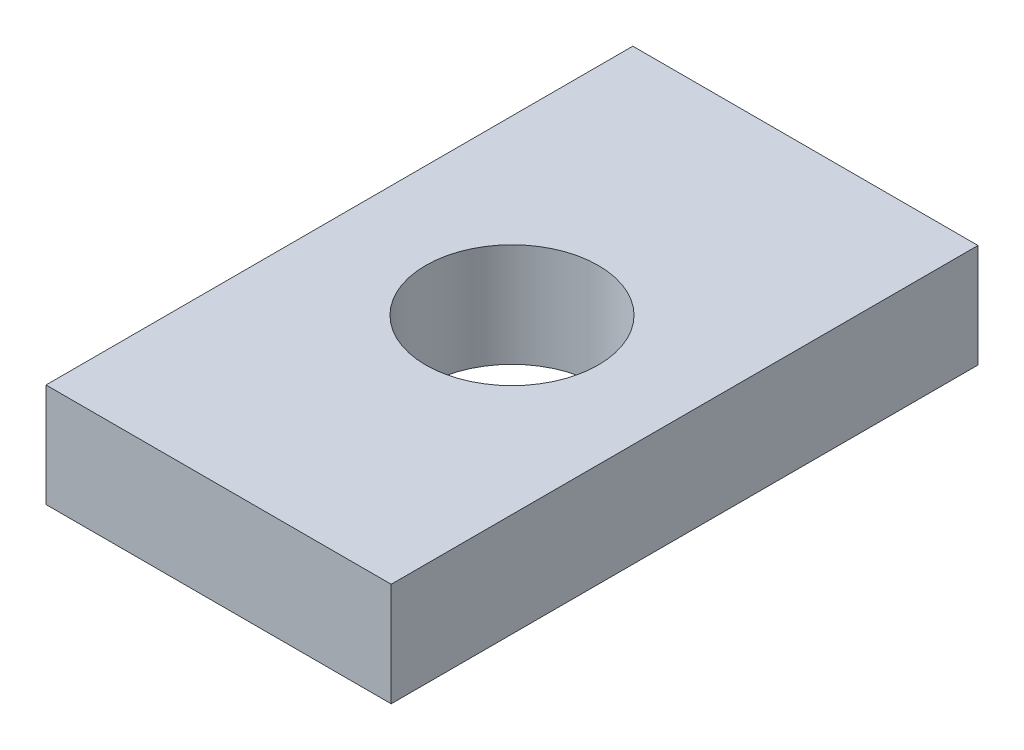
ISO-10303-21;
HEADER;
FILE_DESCRIPTION(('STEP AP214'),'2;1');
FILE_NAME('part.step','',(''),(''),'','','');
FILE_SCHEMA(('AUTOMOTIVE_DESIGN { 1 0 10303 214 1 1 1 1 }'));
ENDSEC;
DATA;
#1=APPLICATION_CONTEXT('core data for automotive mechanical design processes');
#2=APPLICATION_PROTOCOL_DEFINITION('international standard','automotive_design',2000,#1);
#3=PRODUCT_CONTEXT('',#1,'mechanical');
#4=PRODUCT('Part','Part','',(#3));
#5=PRODUCT_RELATED_PRODUCT_CATEGORY('part','',(#4));
#6=PRODUCT_DEFINITION_FORMATION('','',#4);
#7=PRODUCT_DEFINITION_CONTEXT('part definition',#1,'design');
#8=PRODUCT_DEFINITION('design','',#6,#7);
#9=PRODUCT_DEFINITION_SHAPE('','',#8);
#10=(LENGTH_UNIT() NAMED_UNIT(*) SI_UNIT(.MILLI.,.METRE.));
#11=(NAMED_UNIT(*) PLANE_ANGLE_UNIT() SI_UNIT($,.RADIAN.));
#12=(NAMED_UNIT(*) SI_UNIT($,.STERADIAN.) SOLID_ANGLE_UNIT());
#13=UNCERTAINTY_MEASURE_WITH_UNIT(LENGTH_MEASURE(1.E-05),#10,'distance_accuracy_value','');
#14=(GEOMETRIC_REPRESENTATION_CONTEXT(3) GLOBAL_UNCERTAINTY_ASSIGNED_CONTEXT((#13)) GLOBAL_UNIT_ASSIGNED_CONTEXT((#10,
#11,#12)) REPRESENTATION_CONTEXT('',''));
#15=CARTESIAN_POINT('',(0.,0.,0.));
#16=DIRECTION('',(0.,0.,1.));
#17=DIRECTION('',(1.,0.,0.));
#18=AXIS2_PLACEMENT_3D('',#15,#16,#17);
#19=CARTESIAN_POINT('',(0.,6.,0.));
#20=DIRECTION('',(0.,1.,0.));
#21=DIRECTION('',(0.,0.,1.));
#22=AXIS2_PLACEMENT_3D('',#19,#20,#21);
#23=PLANE('',#22);
#24=DIRECTION('',(0.,0.,-1.));
#25=VECTOR('',#24,1.);
#26=CARTESIAN_POINT('',(10.,6.,-17.));
#27=LINE('',#26,#25);
#28=CARTESIAN_POINT('',(10.,6.,17.));
#29=VERTEX_POINT('',#28);
#30=CARTESIAN_POINT('',(10.,6.,-17.));
#31=VERTEX_POINT('',#30);
#32=EDGE_CURVE('E85',#29,#31,#27,.T.);
#33=ORIENTED_EDGE('',*,*,#32,.T.);
#34=DIRECTION('',(-1.,0.,0.));
#35=VECTOR('',#34,1.);
#36=CARTESIAN_POINT('',(-10.,6.,-17.));
#37=LINE('',#36,#35);
#38=CARTESIAN_POINT('',(-10.,6.,-17.));
#39=VERTEX_POINT('',#38);
#40=EDGE_CURVE('E80',#31,#39,#37,.T.);
#41=ORIENTED_EDGE('',*,*,#40,.T.);
#42=DIRECTION('',(0.,0.,1.));
#43=VECTOR('',#42,1.);
#44=CARTESIAN_POINT('',(-10.,6.,-17.));
#45=LINE('',#44,#43);
#46=CARTESIAN_POINT('',(-10.,6.,17.));
#47=VERTEX_POINT('',#46);
#48=EDGE_CURVE('E83',#39,#47,#45,.T.);
#49=ORIENTED_EDGE('',*,*,#48,.T.);
#50=DIRECTION('',(1.,0.,0.));
#51=VECTOR('',#50,1.);
#52=CARTESIAN_POINT('',(-10.,6.,17.));
#53=LINE('',#52,#51);
#54=EDGE_CURVE('E50',#47,#29,#53,.T.);
#55=ORIENTED_EDGE('',*,*,#54,.T.);
#56=EDGE_LOOP('',(#33,#41,#49,#55));
#57=FACE_BOUND('',#56,.T.);
#58=CARTESIAN_POINT('',(0.,6.,0.));
#59=DIRECTION('',(0.,1.,0.));
#60=DIRECTION('',(0.,0.,1.));
#61=AXIS2_PLACEMENT_3D('',#58,#59,#60);
#62=CIRCLE('',#61,5.);
#63=CARTESIAN_POINT('',(0.,6.,5.));
#64=VERTEX_POINT('',#63);
#65=EDGE_CURVE('E100',#64,#64,#62,.T.);
#66=ORIENTED_EDGE('',*,*,#65,.F.);
#67=EDGE_LOOP('',(#66));
#68=FACE_BOUND('',#67,.T.);
#69=ADVANCED_FACE('F33',(#57,#68),#23,.T.);
#70=CARTESIAN_POINT('',(0.,0.,0.));
#71=DIRECTION('',(0.,1.,0.));
#72=DIRECTION('',(0.,0.,1.));
#73=AXIS2_PLACEMENT_3D('',#70,#71,#72);
#74=PLANE('',#73);
#75=DIRECTION('',(0.,0.,-1.));
#76=VECTOR('',#75,1.);
#77=CARTESIAN_POINT('',(10.,0.,-17.));
#78=LINE('',#77,#76);
#79=CARTESIAN_POINT('',(10.,0.,17.));
#80=VERTEX_POINT('',#79);
#81=CARTESIAN_POINT('',(10.,0.,-17.));
#82=VERTEX_POINT('',#81);
#83=EDGE_CURVE('E97',#80,#82,#78,.T.);
#84=ORIENTED_EDGE('',*,*,#83,.F.);
#85=DIRECTION('',(1.,0.,0.));
#86=VECTOR('',#85,1.);
#87=CARTESIAN_POINT('',(-10.,0.,17.));
#88=LINE('',#87,#86);
#89=CARTESIAN_POINT('',(-10.,0.,17.));
#90=VERTEX_POINT('',#89);
#91=EDGE_CURVE('E73',#90,#80,#88,.T.);
#92=ORIENTED_EDGE('',*,*,#91,.F.);
#93=DIRECTION('',(0.,0.,1.));
#94=VECTOR('',#93,1.);
#95=CARTESIAN_POINT('',(-10.,0.,-17.));
#96=LINE('',#95,#94);
#97=CARTESIAN_POINT('',(-10.,0.,-17.));
#98=VERTEX_POINT('',#97);
#99=EDGE_CURVE('E67',#98,#90,#96,.T.);
#100=ORIENTED_EDGE('',*,*,#99,.F.);
#101=DIRECTION('',(-1.,0.,0.));
#102=VECTOR('',#101,1.);
#103=CARTESIAN_POINT('',(-10.,0.,-17.));
#104=LINE('',#103,#102);
#105=EDGE_CURVE('E89',#82,#98,#104,.T.);
#106=ORIENTED_EDGE('',*,*,#105,.F.);
#107=EDGE_LOOP('',(#84,#92,#100,#106));
#108=FACE_BOUND('',#107,.T.);
#109=CARTESIAN_POINT('',(0.,0.,0.));
#110=DIRECTION('',(0.,1.,0.));
#111=DIRECTION('',(0.,0.,1.));
#112=AXIS2_PLACEMENT_3D('',#109,#110,#111);
#113=CIRCLE('',#112,5.);
#114=CARTESIAN_POINT('',(0.,0.,5.));
#115=VERTEX_POINT('',#114);
#116=EDGE_CURVE('E112',#115,#115,#113,.T.);
#117=ORIENTED_EDGE('',*,*,#116,.T.);
#118=EDGE_LOOP('',(#117));
#119=FACE_BOUND('',#118,.T.);
#120=ADVANCED_FACE('F108',(#108,#119),#74,.F.);
#121=CARTESIAN_POINT('',(10.,6.,-17.));
#122=DIRECTION('',(-1.,0.,0.));
#123=DIRECTION('',(0.,0.,1.));
#124=AXIS2_PLACEMENT_3D('',#121,#122,#123);
#125=PLANE('',#124);
#126=ORIENTED_EDGE('',*,*,#83,.T.);
#127=DIRECTION('',(0.,-1.,0.));
#128=VECTOR('',#127,1.);
#129=CARTESIAN_POINT('',(10.,6.,-17.));
#130=LINE('',#129,#128);
#131=EDGE_CURVE('E11',#31,#82,#130,.T.);
#132=ORIENTED_EDGE('',*,*,#131,.F.);
#133=ORIENTED_EDGE('',*,*,#32,.F.);
#134=DIRECTION('',(0.,-1.,0.));
#135=VECTOR('',#134,1.);
#136=CARTESIAN_POINT('',(10.,6.,17.));
#137=LINE('',#136,#135);
#138=EDGE_CURVE('E93',#29,#80,#137,.T.);
#139=ORIENTED_EDGE('',*,*,#138,.T.);
#140=EDGE_LOOP('',(#126,#132,#133,#139));
#141=FACE_BOUND('',#140,.T.);
#142=ADVANCED_FACE('F35',(#141),#125,.F.);
#143=CARTESIAN_POINT('',(-10.,6.,-17.));
#144=DIRECTION('',(0.,0.,1.));
#145=DIRECTION('',(1.,0.,0.));
#146=AXIS2_PLACEMENT_3D('',#143,#144,#145);
#147=PLANE('',#146);
#148=ORIENTED_EDGE('',*,*,#105,.T.);
#149=DIRECTION('',(0.,-1.,0.));
#150=VECTOR('',#149,1.);
#151=CARTESIAN_POINT('',(-10.,6.,-17.));
#152=LINE('',#151,#150);
#153=EDGE_CURVE('E42',#39,#98,#152,.T.);
#154=ORIENTED_EDGE('',*,*,#153,.F.);
#155=ORIENTED_EDGE('',*,*,#40,.F.);
#156=ORIENTED_EDGE('',*,*,#131,.T.);
#157=EDGE_LOOP('',(#148,#154,#155,#156));
#158=FACE_BOUND('',#157,.T.);
#159=ADVANCED_FACE('F88',(#158),#147,.F.);
#160=CARTESIAN_POINT('',(-10.,6.,-17.));
#161=DIRECTION('',(1.,0.,0.));
#162=DIRECTION('',(0.,0.,-1.));
#163=AXIS2_PLACEMENT_3D('',#160,#161,#162);
#164=PLANE('',#163);
#165=ORIENTED_EDGE('',*,*,#99,.T.);
#166=DIRECTION('',(0.,-1.,0.));
#167=VECTOR('',#166,1.);
#168=CARTESIAN_POINT('',(-10.,6.,17.));
#169=LINE('',#168,#167);
#170=EDGE_CURVE('E90',#47,#90,#169,.T.);
#171=ORIENTED_EDGE('',*,*,#170,.F.);
#172=ORIENTED_EDGE('',*,*,#48,.F.);
#173=ORIENTED_EDGE('',*,*,#153,.T.);
#174=EDGE_LOOP('',(#165,#171,#172,#173));
#175=FACE_BOUND('',#174,.T.);
#176=ADVANCED_FACE('F91',(#175),#164,.F.);
#177=CARTESIAN_POINT('',(-10.,6.,17.));
#178=DIRECTION('',(0.,0.,-1.));
#179=DIRECTION('',(-1.,0.,0.));
#180=AXIS2_PLACEMENT_3D('',#177,#178,#179);
#181=PLANE('',#180);
#182=ORIENTED_EDGE('',*,*,#91,.T.);
#183=ORIENTED_EDGE('',*,*,#138,.F.);
#184=ORIENTED_EDGE('',*,*,#54,.F.);
#185=ORIENTED_EDGE('',*,*,#170,.T.);
#186=EDGE_LOOP('',(#182,#183,#184,#185));
#187=FACE_BOUND('',#186,.T.);
#188=ADVANCED_FACE('F105',(#187),#181,.F.);
#189=CARTESIAN_POINT('',(0.,6.,0.));
#190=DIRECTION('',(0.,-1.,0.));
#191=DIRECTION('',(0.,0.,-1.));
#192=AXIS2_PLACEMENT_3D('',#189,#190,#191);
#193=CYLINDRICAL_SURFACE('',#192,5.);
#194=ORIENTED_EDGE('',*,*,#65,.T.);
#195=EDGE_LOOP('',(#194));
#196=FACE_BOUND('',#195,.T.);
#197=ORIENTED_EDGE('',*,*,#116,.F.);
#198=EDGE_LOOP('',(#197));
#199=FACE_BOUND('',#198,.T.);
#200=ADVANCED_FACE('F118',(#196,#199),#193,.F.);
#201=CLOSED_SHELL('',(#69,#120,#142,#159,#176,#188,#200));
#202=MANIFOLD_SOLID_BREP('B2',#201);
#203=ADVANCED_BREP_SHAPE_REPRESENTATION('',(#18,#202),#14);
#204=SHAPE_DEFINITION_REPRESENTATION(#9,#203);
ENDSEC;
END-ISO-10303-21;
